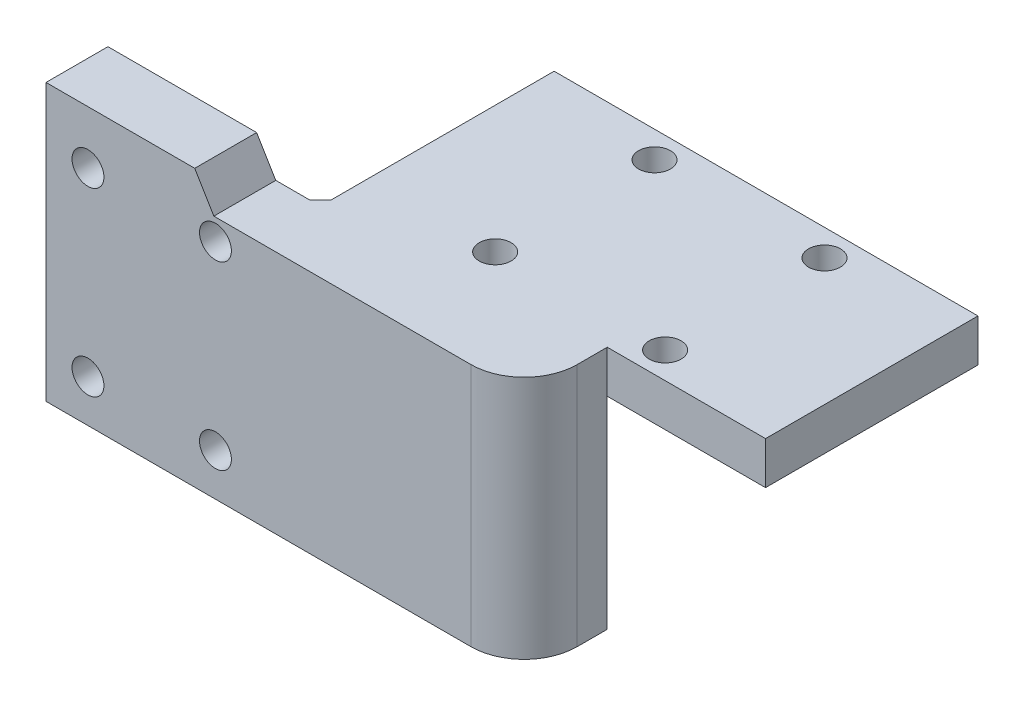
ISO-10303-21;
HEADER;
FILE_DESCRIPTION(('STEP AP214'),'2;1');
FILE_NAME('part.step','',(''),(''),'','','');
FILE_SCHEMA(('AUTOMOTIVE_DESIGN { 1 0 10303 214 1 1 1 1 }'));
ENDSEC;
DATA;
#1=APPLICATION_CONTEXT('core data for automotive mechanical design processes');
#2=APPLICATION_PROTOCOL_DEFINITION('international standard','automotive_design',2000,#1);
#3=PRODUCT_CONTEXT('',#1,'mechanical');
#4=PRODUCT('Part','Part','',(#3));
#5=PRODUCT_RELATED_PRODUCT_CATEGORY('part','',(#4));
#6=PRODUCT_DEFINITION_FORMATION('','',#4);
#7=PRODUCT_DEFINITION_CONTEXT('part definition',#1,'design');
#8=PRODUCT_DEFINITION('design','',#6,#7);
#9=PRODUCT_DEFINITION_SHAPE('','',#8);
#10=(LENGTH_UNIT() NAMED_UNIT(*) SI_UNIT(.MILLI.,.METRE.));
#11=(NAMED_UNIT(*) PLANE_ANGLE_UNIT() SI_UNIT($,.RADIAN.));
#12=(NAMED_UNIT(*) SI_UNIT($,.STERADIAN.) SOLID_ANGLE_UNIT());
#13=UNCERTAINTY_MEASURE_WITH_UNIT(LENGTH_MEASURE(1.E-05),#10,'distance_accuracy_value','');
#14=(GEOMETRIC_REPRESENTATION_CONTEXT(3) GLOBAL_UNCERTAINTY_ASSIGNED_CONTEXT((#13)) GLOBAL_UNIT_ASSIGNED_CONTEXT((#10,
#11,#12)) REPRESENTATION_CONTEXT('',''));
#15=CARTESIAN_POINT('',(0.,0.,0.));
#16=DIRECTION('',(0.,0.,1.));
#17=DIRECTION('',(1.,0.,0.));
#18=AXIS2_PLACEMENT_3D('',#15,#16,#17);
#19=CARTESIAN_POINT('',(0.,4.,0.));
#20=DIRECTION('',(0.,-1.,0.));
#21=DIRECTION('',(0.,0.,-1.));
#22=AXIS2_PLACEMENT_3D('',#19,#20,#21);
#23=PLANE('',#22);
#24=CARTESIAN_POINT('',(-8.,4.,-7.5));
#25=DIRECTION('',(0.,1.,0.));
#26=DIRECTION('',(0.,0.,-1.));
#27=AXIS2_PLACEMENT_3D('',#24,#25,#26);
#28=CIRCLE('',#27,1.5);
#29=CARTESIAN_POINT('',(-8.,4.,-9.));
#30=VERTEX_POINT('',#29);
#31=EDGE_CURVE('E252',#30,#30,#28,.T.);
#32=ORIENTED_EDGE('',*,*,#31,.F.);
#33=EDGE_LOOP('',(#32));
#34=FACE_BOUND('',#33,.T.);
#35=CARTESIAN_POINT('',(-8.,4.,7.5));
#36=DIRECTION('',(0.,1.,0.));
#37=DIRECTION('',(0.,0.,1.));
#38=AXIS2_PLACEMENT_3D('',#35,#36,#37);
#39=CIRCLE('',#38,1.5);
#40=CARTESIAN_POINT('',(-8.,4.,9.));
#41=VERTEX_POINT('',#40);
#42=EDGE_CURVE('E260',#41,#41,#39,.T.);
#43=ORIENTED_EDGE('',*,*,#42,.F.);
#44=EDGE_LOOP('',(#43));
#45=FACE_BOUND('',#44,.T.);
#46=CARTESIAN_POINT('',(8.,4.,7.5));
#47=DIRECTION('',(0.,1.,0.));
#48=DIRECTION('',(0.,0.,-1.));
#49=AXIS2_PLACEMENT_3D('',#46,#47,#48);
#50=CIRCLE('',#49,1.5);
#51=CARTESIAN_POINT('',(8.,4.,6.));
#52=VERTEX_POINT('',#51);
#53=EDGE_CURVE('E268',#52,#52,#50,.T.);
#54=ORIENTED_EDGE('',*,*,#53,.F.);
#55=EDGE_LOOP('',(#54));
#56=FACE_BOUND('',#55,.T.);
#57=CARTESIAN_POINT('',(8.,4.,-7.5));
#58=DIRECTION('',(0.,1.,0.));
#59=DIRECTION('',(0.,0.,1.));
#60=AXIS2_PLACEMENT_3D('',#57,#58,#59);
#61=CIRCLE('',#60,1.5);
#62=CARTESIAN_POINT('',(8.,4.,-6.));
#63=VERTEX_POINT('',#62);
#64=EDGE_CURVE('E276',#63,#63,#61,.T.);
#65=ORIENTED_EDGE('',*,*,#64,.F.);
#66=EDGE_LOOP('',(#65));
#67=FACE_BOUND('',#66,.T.);
#68=DIRECTION('',(0.,0.,-1.));
#69=VECTOR('',#68,1.);
#70=CARTESIAN_POINT('',(-19.95,4.,10.));
#71=LINE('',#70,#69);
#72=CARTESIAN_POINT('',(-19.95,4.,11.));
#73=VERTEX_POINT('',#72);
#74=CARTESIAN_POINT('',(-19.95,4.,-10.));
#75=VERTEX_POINT('',#74);
#76=EDGE_CURVE('E201',#73,#75,#71,.T.);
#77=ORIENTED_EDGE('',*,*,#76,.F.);
#78=DIRECTION('',(0.70710678118655,0.,-0.707106781186545));
#79=VECTOR('',#78,1.);
#80=CARTESIAN_POINT('',(-4.47499999999993,4.,-4.47499999999996));
#81=LINE('',#80,#79);
#82=CARTESIAN_POINT('',(-20.95,4.,12.));
#83=VERTEX_POINT('',#82);
#84=EDGE_CURVE('E54',#73,#83,#81,.F.);
#85=ORIENTED_EDGE('',*,*,#84,.T.);
#86=DIRECTION('',(1.,0.,0.));
#87=VECTOR('',#86,1.);
#88=CARTESIAN_POINT('',(0.,4.,12.));
#89=LINE('',#88,#87);
#90=CARTESIAN_POINT('',(-24.15,4.,12.));
#91=VERTEX_POINT('',#90);
#92=EDGE_CURVE('E343',#91,#83,#89,.T.);
#93=ORIENTED_EDGE('',*,*,#92,.F.);
#94=DIRECTION('',(0.,0.,1.));
#95=VECTOR('',#94,1.);
#96=CARTESIAN_POINT('',(-24.15,4.,7.83));
#97=LINE('',#96,#95);
#98=CARTESIAN_POINT('',(-24.15,4.,17.83));
#99=VERTEX_POINT('',#98);
#100=EDGE_CURVE('E158',#91,#99,#97,.T.);
#101=ORIENTED_EDGE('',*,*,#100,.T.);
#102=DIRECTION('',(1.,0.,0.));
#103=VECTOR('',#102,1.);
#104=CARTESIAN_POINT('',(-39.95,4.,17.83));
#105=LINE('',#104,#103);
#106=CARTESIAN_POINT('',(0.0500000000000084,4.,17.83));
#107=VERTEX_POINT('',#106);
#108=EDGE_CURVE('E155',#99,#107,#105,.T.);
#109=ORIENTED_EDGE('',*,*,#108,.T.);
#110=CARTESIAN_POINT('',(0.0500000000000058,4.,12.83));
#111=DIRECTION('',(0.,-1.,0.));
#112=DIRECTION('',(0.,0.,-1.));
#113=AXIS2_PLACEMENT_3D('',#110,#111,#112);
#114=CIRCLE('',#113,5.);
#115=CARTESIAN_POINT('',(5.05000000000001,4.,12.83));
#116=VERTEX_POINT('',#115);
#117=EDGE_CURVE('E324',#107,#116,#114,.F.);
#118=ORIENTED_EDGE('',*,*,#117,.T.);
#119=DIRECTION('',(0.,0.,-1.));
#120=VECTOR('',#119,1.);
#121=CARTESIAN_POINT('',(5.05000000000001,4.,51.8005755029261));
#122=LINE('',#121,#120);
#123=CARTESIAN_POINT('',(5.05000000000001,4.,10.));
#124=VERTEX_POINT('',#123);
#125=EDGE_CURVE('E213',#116,#124,#122,.T.);
#126=ORIENTED_EDGE('',*,*,#125,.T.);
#127=DIRECTION('',(1.,0.,0.));
#128=VECTOR('',#127,1.);
#129=CARTESIAN_POINT('',(-19.95,4.,10.));
#130=LINE('',#129,#128);
#131=CARTESIAN_POINT('',(19.95,4.,10.));
#132=VERTEX_POINT('',#131);
#133=EDGE_CURVE('E293',#124,#132,#130,.T.);
#134=ORIENTED_EDGE('',*,*,#133,.T.);
#135=DIRECTION('',(0.,0.,-1.));
#136=VECTOR('',#135,1.);
#137=CARTESIAN_POINT('',(19.95,4.,10.));
#138=LINE('',#137,#136);
#139=CARTESIAN_POINT('',(19.95,4.,-10.));
#140=VERTEX_POINT('',#139);
#141=EDGE_CURVE('E284',#132,#140,#138,.T.);
#142=ORIENTED_EDGE('',*,*,#141,.T.);
#143=DIRECTION('',(-1.,0.,0.));
#144=VECTOR('',#143,1.);
#145=CARTESIAN_POINT('',(-19.95,4.,-10.));
#146=LINE('',#145,#144);
#147=EDGE_CURVE('E288',#140,#75,#146,.T.);
#148=ORIENTED_EDGE('',*,*,#147,.T.);
#149=EDGE_LOOP('',(#77,#85,#93,#101,#109,#118,#126,#134,#142,#148));
#150=FACE_BOUND('',#149,.T.);
#151=ADVANCED_FACE('F44',(#34,#45,#56,#67,#150),#23,.F.);
#152=CARTESIAN_POINT('',(-39.95,0.,0.));
#153=DIRECTION('',(1.,0.,0.));
#154=DIRECTION('',(0.,0.,-1.));
#155=AXIS2_PLACEMENT_3D('',#152,#153,#154);
#156=PLANE('',#155);
#157=DIRECTION('',(0.,1.,0.));
#158=VECTOR('',#157,1.);
#159=CARTESIAN_POINT('',(-39.95,4.,17.83));
#160=LINE('',#159,#158);
#161=CARTESIAN_POINT('',(-39.95,-19.,17.83));
#162=VERTEX_POINT('',#161);
#163=CARTESIAN_POINT('',(-39.95,7.,17.83));
#164=VERTEX_POINT('',#163);
#165=EDGE_CURVE('E239',#162,#164,#160,.T.);
#166=ORIENTED_EDGE('',*,*,#165,.T.);
#167=DIRECTION('',(0.,0.,1.));
#168=VECTOR('',#167,1.);
#169=CARTESIAN_POINT('',(-39.95,7.,17.83));
#170=LINE('',#169,#168);
#171=CARTESIAN_POINT('',(-39.95,7.,12.));
#172=VERTEX_POINT('',#171);
#173=EDGE_CURVE('E163',#172,#164,#170,.T.);
#174=ORIENTED_EDGE('',*,*,#173,.F.);
#175=DIRECTION('',(0.,1.,0.));
#176=VECTOR('',#175,1.);
#177=CARTESIAN_POINT('',(-39.95,4.,12.));
#178=LINE('',#177,#176);
#179=CARTESIAN_POINT('',(-39.95,-19.,12.));
#180=VERTEX_POINT('',#179);
#181=EDGE_CURVE('E178',#180,#172,#178,.T.);
#182=ORIENTED_EDGE('',*,*,#181,.F.);
#183=DIRECTION('',(0.,0.,1.));
#184=VECTOR('',#183,1.);
#185=CARTESIAN_POINT('',(-39.95,-19.,17.83));
#186=LINE('',#185,#184);
#187=EDGE_CURVE('E236',#180,#162,#186,.T.);
#188=ORIENTED_EDGE('',*,*,#187,.T.);
#189=EDGE_LOOP('',(#166,#174,#182,#188));
#190=FACE_BOUND('',#189,.T.);
#191=ADVANCED_FACE('F355',(#190),#156,.F.);
#192=CARTESIAN_POINT('',(-36.,2.,2.83));
#193=DIRECTION('',(0.,0.,1.));
#194=DIRECTION('',(1.,0.,0.));
#195=AXIS2_PLACEMENT_3D('',#192,#193,#194);
#196=CYLINDRICAL_SURFACE('',#195,1.5);
#197=CARTESIAN_POINT('',(-36.,2.,12.));
#198=DIRECTION('',(0.,0.,1.));
#199=DIRECTION('',(1.,0.,0.));
#200=AXIS2_PLACEMENT_3D('',#197,#198,#199);
#201=CIRCLE('',#200,1.5);
#202=CARTESIAN_POINT('',(-34.5,2.,12.));
#203=VERTEX_POINT('',#202);
#204=EDGE_CURVE('E194',#203,#203,#201,.F.);
#205=ORIENTED_EDGE('',*,*,#204,.T.);
#206=EDGE_LOOP('',(#205));
#207=FACE_BOUND('',#206,.T.);
#208=CARTESIAN_POINT('',(-36.,2.,17.83));
#209=DIRECTION('',(0.,0.,1.));
#210=DIRECTION('',(1.,0.,0.));
#211=AXIS2_PLACEMENT_3D('',#208,#209,#210);
#212=CIRCLE('',#211,1.5);
#213=CARTESIAN_POINT('',(-34.5,2.,17.83));
#214=VERTEX_POINT('',#213);
#215=EDGE_CURVE('E229',#214,#214,#212,.T.);
#216=ORIENTED_EDGE('',*,*,#215,.T.);
#217=EDGE_LOOP('',(#216));
#218=FACE_BOUND('',#217,.T.);
#219=ADVANCED_FACE('F418',(#207,#218),#196,.F.);
#220=CARTESIAN_POINT('',(-24.,2.,2.83));
#221=DIRECTION('',(0.,0.,1.));
#222=DIRECTION('',(1.,0.,0.));
#223=AXIS2_PLACEMENT_3D('',#220,#221,#222);
#224=CYLINDRICAL_SURFACE('',#223,1.5);
#225=CARTESIAN_POINT('',(-24.,2.,12.));
#226=DIRECTION('',(0.,0.,1.));
#227=DIRECTION('',(1.,0.,0.));
#228=AXIS2_PLACEMENT_3D('',#225,#226,#227);
#229=CIRCLE('',#228,1.5);
#230=CARTESIAN_POINT('',(-22.5,2.,12.));
#231=VERTEX_POINT('',#230);
#232=EDGE_CURVE('E190',#231,#231,#229,.F.);
#233=ORIENTED_EDGE('',*,*,#232,.T.);
#234=EDGE_LOOP('',(#233));
#235=FACE_BOUND('',#234,.T.);
#236=CARTESIAN_POINT('',(-24.,2.,17.83));
#237=DIRECTION('',(0.,0.,1.));
#238=DIRECTION('',(1.,0.,0.));
#239=AXIS2_PLACEMENT_3D('',#236,#237,#238);
#240=CIRCLE('',#239,1.5);
#241=CARTESIAN_POINT('',(-22.5,2.,17.83));
#242=VERTEX_POINT('',#241);
#243=EDGE_CURVE('E225',#242,#242,#240,.T.);
#244=ORIENTED_EDGE('',*,*,#243,.T.);
#245=EDGE_LOOP('',(#244));
#246=FACE_BOUND('',#245,.T.);
#247=ADVANCED_FACE('F430',(#235,#246),#224,.F.);
#248=CARTESIAN_POINT('',(-19.95,4.,10.));
#249=DIRECTION('',(0.,0.,-1.));
#250=DIRECTION('',(-1.,0.,0.));
#251=AXIS2_PLACEMENT_3D('',#248,#249,#250);
#252=PLANE('',#251);
#253=DIRECTION('',(0.,1.,0.));
#254=VECTOR('',#253,1.);
#255=CARTESIAN_POINT('',(5.05000000000001,-19.,10.));
#256=LINE('',#255,#254);
#257=CARTESIAN_POINT('',(5.05000000000001,0.,10.));
#258=VERTEX_POINT('',#257);
#259=EDGE_CURVE('E206',#258,#124,#256,.T.);
#260=ORIENTED_EDGE('',*,*,#259,.F.);
#261=DIRECTION('',(1.,0.,0.));
#262=VECTOR('',#261,1.);
#263=CARTESIAN_POINT('',(-19.95,0.,10.));
#264=LINE('',#263,#262);
#265=CARTESIAN_POINT('',(19.95,0.,10.));
#266=VERTEX_POINT('',#265);
#267=EDGE_CURVE('E304',#258,#266,#264,.T.);
#268=ORIENTED_EDGE('',*,*,#267,.T.);
#269=DIRECTION('',(0.,-1.,0.));
#270=VECTOR('',#269,1.);
#271=CARTESIAN_POINT('',(19.95,4.,10.));
#272=LINE('',#271,#270);
#273=EDGE_CURVE('E296',#132,#266,#272,.T.);
#274=ORIENTED_EDGE('',*,*,#273,.F.);
#275=ORIENTED_EDGE('',*,*,#133,.F.);
#276=EDGE_LOOP('',(#260,#268,#274,#275));
#277=FACE_BOUND('',#276,.T.);
#278=ADVANCED_FACE('F383',(#277),#252,.F.);
#279=CARTESIAN_POINT('',(0.,0.,0.));
#280=DIRECTION('',(0.,-1.,0.));
#281=DIRECTION('',(0.,0.,-1.));
#282=AXIS2_PLACEMENT_3D('',#279,#280,#281);
#283=PLANE('',#282);
#284=DIRECTION('',(0.,0.,-1.));
#285=VECTOR('',#284,1.);
#286=CARTESIAN_POINT('',(-19.95,0.,10.));
#287=LINE('',#286,#285);
#288=CARTESIAN_POINT('',(-19.95,0.,10.));
#289=VERTEX_POINT('',#288);
#290=CARTESIAN_POINT('',(-19.95,0.,-10.));
#291=VERTEX_POINT('',#290);
#292=EDGE_CURVE('E202',#289,#291,#287,.T.);
#293=ORIENTED_EDGE('',*,*,#292,.T.);
#294=DIRECTION('',(-1.,0.,0.));
#295=VECTOR('',#294,1.);
#296=CARTESIAN_POINT('',(-19.95,0.,-10.));
#297=LINE('',#296,#295);
#298=CARTESIAN_POINT('',(19.95,0.,-10.));
#299=VERTEX_POINT('',#298);
#300=EDGE_CURVE('E300',#299,#291,#297,.T.);
#301=ORIENTED_EDGE('',*,*,#300,.F.);
#302=DIRECTION('',(0.,0.,-1.));
#303=VECTOR('',#302,1.);
#304=CARTESIAN_POINT('',(19.95,0.,10.));
#305=LINE('',#304,#303);
#306=EDGE_CURVE('E280',#266,#299,#305,.T.);
#307=ORIENTED_EDGE('',*,*,#306,.F.);
#308=ORIENTED_EDGE('',*,*,#267,.F.);
#309=EDGE_CURVE('E289',#289,#258,#264,.T.);
#310=ORIENTED_EDGE('',*,*,#309,.F.);
#311=EDGE_LOOP('',(#293,#301,#307,#308,#310));
#312=FACE_BOUND('',#311,.T.);
#313=CARTESIAN_POINT('',(-8.,0.,7.5));
#314=DIRECTION('',(0.,1.,0.));
#315=DIRECTION('',(0.,0.,1.));
#316=AXIS2_PLACEMENT_3D('',#313,#314,#315);
#317=CIRCLE('',#316,1.5);
#318=CARTESIAN_POINT('',(-8.,0.,9.));
#319=VERTEX_POINT('',#318);
#320=EDGE_CURVE('E256',#319,#319,#317,.T.);
#321=ORIENTED_EDGE('',*,*,#320,.T.);
#322=EDGE_LOOP('',(#321));
#323=FACE_BOUND('',#322,.T.);
#324=CARTESIAN_POINT('',(8.,0.,-7.5));
#325=DIRECTION('',(0.,1.,0.));
#326=DIRECTION('',(0.,0.,1.));
#327=AXIS2_PLACEMENT_3D('',#324,#325,#326);
#328=CIRCLE('',#327,1.5);
#329=CARTESIAN_POINT('',(8.,0.,-6.));
#330=VERTEX_POINT('',#329);
#331=EDGE_CURVE('E272',#330,#330,#328,.T.);
#332=ORIENTED_EDGE('',*,*,#331,.T.);
#333=EDGE_LOOP('',(#332));
#334=FACE_BOUND('',#333,.T.);
#335=CARTESIAN_POINT('',(8.,0.,7.5));
#336=DIRECTION('',(0.,1.,0.));
#337=DIRECTION('',(0.,0.,-1.));
#338=AXIS2_PLACEMENT_3D('',#335,#336,#337);
#339=CIRCLE('',#338,1.5);
#340=CARTESIAN_POINT('',(8.,0.,6.));
#341=VERTEX_POINT('',#340);
#342=EDGE_CURVE('E264',#341,#341,#339,.T.);
#343=ORIENTED_EDGE('',*,*,#342,.T.);
#344=EDGE_LOOP('',(#343));
#345=FACE_BOUND('',#344,.T.);
#346=CARTESIAN_POINT('',(-8.,0.,-7.5));
#347=DIRECTION('',(0.,1.,0.));
#348=DIRECTION('',(0.,0.,-1.));
#349=AXIS2_PLACEMENT_3D('',#346,#347,#348);
#350=CIRCLE('',#349,1.5);
#351=CARTESIAN_POINT('',(-8.,0.,-9.));
#352=VERTEX_POINT('',#351);
#353=EDGE_CURVE('E251',#352,#352,#350,.T.);
#354=ORIENTED_EDGE('',*,*,#353,.T.);
#355=EDGE_LOOP('',(#354));
#356=FACE_BOUND('',#355,.T.);
#357=ADVANCED_FACE('F388',(#312,#323,#334,#345,#356),#283,.T.);
#358=CARTESIAN_POINT('',(19.95,4.,10.));
#359=DIRECTION('',(-1.,0.,0.));
#360=DIRECTION('',(0.,0.,1.));
#361=AXIS2_PLACEMENT_3D('',#358,#359,#360);
#362=PLANE('',#361);
#363=ORIENTED_EDGE('',*,*,#306,.T.);
#364=DIRECTION('',(0.,-1.,0.));
#365=VECTOR('',#364,1.);
#366=CARTESIAN_POINT('',(19.95,4.,-10.));
#367=LINE('',#366,#365);
#368=EDGE_CURVE('E310',#140,#299,#367,.T.);
#369=ORIENTED_EDGE('',*,*,#368,.F.);
#370=ORIENTED_EDGE('',*,*,#141,.F.);
#371=ORIENTED_EDGE('',*,*,#273,.T.);
#372=EDGE_LOOP('',(#363,#369,#370,#371));
#373=FACE_BOUND('',#372,.T.);
#374=ADVANCED_FACE('F393',(#373),#362,.F.);
#375=CARTESIAN_POINT('',(-19.95,4.,-10.));
#376=DIRECTION('',(0.,0.,1.));
#377=DIRECTION('',(1.,0.,0.));
#378=AXIS2_PLACEMENT_3D('',#375,#376,#377);
#379=PLANE('',#378);
#380=ORIENTED_EDGE('',*,*,#300,.T.);
#381=DIRECTION('',(0.,-1.,0.));
#382=VECTOR('',#381,1.);
#383=CARTESIAN_POINT('',(-19.95,4.,-10.));
#384=LINE('',#383,#382);
#385=EDGE_CURVE('E198',#75,#291,#384,.T.);
#386=ORIENTED_EDGE('',*,*,#385,.F.);
#387=ORIENTED_EDGE('',*,*,#147,.F.);
#388=ORIENTED_EDGE('',*,*,#368,.T.);
#389=EDGE_LOOP('',(#380,#386,#387,#388));
#390=FACE_BOUND('',#389,.T.);
#391=ADVANCED_FACE('F397',(#390),#379,.F.);
#392=CARTESIAN_POINT('',(8.,4.,-7.5));
#393=DIRECTION('',(0.,-1.,0.));
#394=DIRECTION('',(0.,0.,-1.));
#395=AXIS2_PLACEMENT_3D('',#392,#393,#394);
#396=CYLINDRICAL_SURFACE('',#395,1.5);
#397=ORIENTED_EDGE('',*,*,#64,.T.);
#398=EDGE_LOOP('',(#397));
#399=FACE_BOUND('',#398,.T.);
#400=ORIENTED_EDGE('',*,*,#331,.F.);
#401=EDGE_LOOP('',(#400));
#402=FACE_BOUND('',#401,.T.);
#403=ADVANCED_FACE('F424',(#399,#402),#396,.F.);
#404=CARTESIAN_POINT('',(8.,4.,7.5));
#405=DIRECTION('',(0.,-1.,0.));
#406=DIRECTION('',(0.,0.,-1.));
#407=AXIS2_PLACEMENT_3D('',#404,#405,#406);
#408=CYLINDRICAL_SURFACE('',#407,1.5);
#409=ORIENTED_EDGE('',*,*,#53,.T.);
#410=EDGE_LOOP('',(#409));
#411=FACE_BOUND('',#410,.T.);
#412=ORIENTED_EDGE('',*,*,#342,.F.);
#413=EDGE_LOOP('',(#412));
#414=FACE_BOUND('',#413,.T.);
#415=ADVANCED_FACE('F450',(#411,#414),#408,.F.);
#416=CARTESIAN_POINT('',(-8.,4.,7.5));
#417=DIRECTION('',(0.,-1.,0.));
#418=DIRECTION('',(0.,0.,-1.));
#419=AXIS2_PLACEMENT_3D('',#416,#417,#418);
#420=CYLINDRICAL_SURFACE('',#419,1.5);
#421=ORIENTED_EDGE('',*,*,#42,.T.);
#422=EDGE_LOOP('',(#421));
#423=FACE_BOUND('',#422,.T.);
#424=ORIENTED_EDGE('',*,*,#320,.F.);
#425=EDGE_LOOP('',(#424));
#426=FACE_BOUND('',#425,.T.);
#427=ADVANCED_FACE('F457',(#423,#426),#420,.F.);
#428=CARTESIAN_POINT('',(-8.,4.,-7.5));
#429=DIRECTION('',(0.,-1.,0.));
#430=DIRECTION('',(0.,0.,-1.));
#431=AXIS2_PLACEMENT_3D('',#428,#429,#430);
#432=CYLINDRICAL_SURFACE('',#431,1.5);
#433=ORIENTED_EDGE('',*,*,#31,.T.);
#434=EDGE_LOOP('',(#433));
#435=FACE_BOUND('',#434,.T.);
#436=ORIENTED_EDGE('',*,*,#353,.F.);
#437=EDGE_LOOP('',(#436));
#438=FACE_BOUND('',#437,.T.);
#439=ADVANCED_FACE('F464',(#435,#438),#432,.F.);
#440=CARTESIAN_POINT('',(-39.95,-19.,10.));
#441=DIRECTION('',(0.,0.,1.));
#442=DIRECTION('',(1.,0.,0.));
#443=AXIS2_PLACEMENT_3D('',#440,#441,#442);
#444=PLANE('',#443);
#445=DIRECTION('',(1.,0.,0.));
#446=VECTOR('',#445,1.);
#447=CARTESIAN_POINT('',(-39.95,-19.,10.));
#448=LINE('',#447,#446);
#449=CARTESIAN_POINT('',(-19.95,-19.,10.));
#450=VERTEX_POINT('',#449);
#451=CARTESIAN_POINT('',(5.05000000000001,-19.,10.));
#452=VERTEX_POINT('',#451);
#453=EDGE_CURVE('E248',#450,#452,#448,.T.);
#454=ORIENTED_EDGE('',*,*,#453,.F.);
#455=DIRECTION('',(0.,-1.,0.));
#456=VECTOR('',#455,1.);
#457=CARTESIAN_POINT('',(-19.95,-19.,10.));
#458=LINE('',#457,#456);
#459=EDGE_CURVE('E165',#289,#450,#458,.T.);
#460=ORIENTED_EDGE('',*,*,#459,.F.);
#461=ORIENTED_EDGE('',*,*,#309,.T.);
#462=EDGE_CURVE('E209',#452,#258,#256,.T.);
#463=ORIENTED_EDGE('',*,*,#462,.F.);
#464=EDGE_LOOP('',(#454,#460,#461,#463));
#465=FACE_BOUND('',#464,.T.);
#466=ADVANCED_FACE('F376',(#465),#444,.F.);
#467=CARTESIAN_POINT('',(-39.95,-19.,17.83));
#468=DIRECTION('',(0.,1.,0.));
#469=DIRECTION('',(0.,0.,1.));
#470=AXIS2_PLACEMENT_3D('',#467,#468,#469);
#471=PLANE('',#470);
#472=DIRECTION('',(-1.,0.,0.));
#473=VECTOR('',#472,1.);
#474=CARTESIAN_POINT('',(-39.95,-19.,12.));
#475=LINE('',#474,#473);
#476=CARTESIAN_POINT('',(-20.95,-19.,12.));
#477=VERTEX_POINT('',#476);
#478=EDGE_CURVE('E170',#477,#180,#475,.T.);
#479=ORIENTED_EDGE('',*,*,#478,.F.);
#480=DIRECTION('',(-0.70710678118655,0.,0.707106781186545));
#481=VECTOR('',#480,1.);
#482=CARTESIAN_POINT('',(-33.3650000000001,-19.,24.415));
#483=LINE('',#482,#481);
#484=CARTESIAN_POINT('',(-19.95,-19.,11.));
#485=VERTEX_POINT('',#484);
#486=EDGE_CURVE('E336',#477,#485,#483,.F.);
#487=ORIENTED_EDGE('',*,*,#486,.T.);
#488=DIRECTION('',(0.,0.,-1.));
#489=VECTOR('',#488,1.);
#490=CARTESIAN_POINT('',(-19.95,-19.,12.));
#491=LINE('',#490,#489);
#492=EDGE_CURVE('E181',#485,#450,#491,.T.);
#493=ORIENTED_EDGE('',*,*,#492,.T.);
#494=ORIENTED_EDGE('',*,*,#453,.T.);
#495=DIRECTION('',(0.,0.,-1.));
#496=VECTOR('',#495,1.);
#497=CARTESIAN_POINT('',(5.05000000000001,-19.,51.8005755029261));
#498=LINE('',#497,#496);
#499=CARTESIAN_POINT('',(5.05000000000001,-19.,12.83));
#500=VERTEX_POINT('',#499);
#501=EDGE_CURVE('E216',#500,#452,#498,.T.);
#502=ORIENTED_EDGE('',*,*,#501,.F.);
#503=CARTESIAN_POINT('',(0.0500000000000058,-19.,12.83));
#504=DIRECTION('',(0.,1.,0.));
#505=DIRECTION('',(0.,0.,1.));
#506=AXIS2_PLACEMENT_3D('',#503,#504,#505);
#507=CIRCLE('',#506,5.);
#508=CARTESIAN_POINT('',(0.0500000000000084,-19.,17.83));
#509=VERTEX_POINT('',#508);
#510=EDGE_CURVE('E318',#500,#509,#507,.F.);
#511=ORIENTED_EDGE('',*,*,#510,.T.);
#512=DIRECTION('',(1.,0.,0.));
#513=VECTOR('',#512,1.);
#514=CARTESIAN_POINT('',(-39.95,-19.,17.83));
#515=LINE('',#514,#513);
#516=EDGE_CURVE('E244',#162,#509,#515,.T.);
#517=ORIENTED_EDGE('',*,*,#516,.F.);
#518=ORIENTED_EDGE('',*,*,#187,.F.);
#519=EDGE_LOOP('',(#479,#487,#493,#494,#502,#511,#517,#518));
#520=FACE_BOUND('',#519,.T.);
#521=ADVANCED_FACE('F352',(#520),#471,.F.);
#522=CARTESIAN_POINT('',(-39.95,4.,17.83));
#523=DIRECTION('',(0.,0.,-1.));
#524=DIRECTION('',(0.,1.,0.));
#525=AXIS2_PLACEMENT_3D('',#522,#523,#524);
#526=PLANE('',#525);
#527=ORIENTED_EDGE('',*,*,#243,.F.);
#528=EDGE_LOOP('',(#527));
#529=FACE_BOUND('',#528,.T.);
#530=CARTESIAN_POINT('',(-36.,-15.,17.83));
#531=DIRECTION('',(0.,0.,1.));
#532=DIRECTION('',(1.,0.,0.));
#533=AXIS2_PLACEMENT_3D('',#530,#531,#532);
#534=CIRCLE('',#533,1.5);
#535=CARTESIAN_POINT('',(-34.5,-15.,17.83));
#536=VERTEX_POINT('',#535);
#537=EDGE_CURVE('E224',#536,#536,#534,.T.);
#538=ORIENTED_EDGE('',*,*,#537,.F.);
#539=EDGE_LOOP('',(#538));
#540=FACE_BOUND('',#539,.T.);
#541=CARTESIAN_POINT('',(-24.,-15.,17.83));
#542=DIRECTION('',(0.,0.,1.));
#543=DIRECTION('',(1.,0.,0.));
#544=AXIS2_PLACEMENT_3D('',#541,#542,#543);
#545=CIRCLE('',#544,1.5);
#546=CARTESIAN_POINT('',(-22.5,-15.,17.83));
#547=VERTEX_POINT('',#546);
#548=EDGE_CURVE('E220',#547,#547,#545,.T.);
#549=ORIENTED_EDGE('',*,*,#548,.F.);
#550=EDGE_LOOP('',(#549));
#551=FACE_BOUND('',#550,.T.);
#552=ORIENTED_EDGE('',*,*,#215,.F.);
#553=EDGE_LOOP('',(#552));
#554=FACE_BOUND('',#553,.T.);
#555=ORIENTED_EDGE('',*,*,#108,.F.);
#556=DIRECTION('',(0.514495755427526,-0.857492925712545,0.));
#557=VECTOR('',#556,1.);
#558=CARTESIAN_POINT('',(-24.15,4.,17.83));
#559=LINE('',#558,#557);
#560=CARTESIAN_POINT('',(-25.95,7.,17.83));
#561=VERTEX_POINT('',#560);
#562=EDGE_CURVE('E145',#561,#99,#559,.T.);
#563=ORIENTED_EDGE('',*,*,#562,.F.);
#564=DIRECTION('',(1.,0.,0.));
#565=VECTOR('',#564,1.);
#566=CARTESIAN_POINT('',(-19.95,7.,17.83));
#567=LINE('',#566,#565);
#568=EDGE_CURVE('E153',#164,#561,#567,.T.);
#569=ORIENTED_EDGE('',*,*,#568,.F.);
#570=ORIENTED_EDGE('',*,*,#165,.F.);
#571=ORIENTED_EDGE('',*,*,#516,.T.);
#572=DIRECTION('',(0.,-1.,0.));
#573=VECTOR('',#572,1.);
#574=CARTESIAN_POINT('',(0.0500000000000084,4.,17.83));
#575=LINE('',#574,#573);
#576=EDGE_CURVE('E321',#509,#107,#575,.F.);
#577=ORIENTED_EDGE('',*,*,#576,.T.);
#578=EDGE_LOOP('',(#555,#563,#569,#570,#571,#577));
#579=FACE_BOUND('',#578,.T.);
#580=ADVANCED_FACE('F151',(#529,#540,#551,#554,#579),#526,.F.);
#581=CARTESIAN_POINT('',(-24.,-15.,2.83));
#582=DIRECTION('',(0.,0.,1.));
#583=DIRECTION('',(1.,0.,0.));
#584=AXIS2_PLACEMENT_3D('',#581,#582,#583);
#585=CYLINDRICAL_SURFACE('',#584,1.5);
#586=CARTESIAN_POINT('',(-24.,-15.,12.));
#587=DIRECTION('',(0.,0.,1.));
#588=DIRECTION('',(1.,0.,0.));
#589=AXIS2_PLACEMENT_3D('',#586,#587,#588);
#590=CIRCLE('',#589,1.5);
#591=CARTESIAN_POINT('',(-22.5,-15.,12.));
#592=VERTEX_POINT('',#591);
#593=EDGE_CURVE('E186',#592,#592,#590,.F.);
#594=ORIENTED_EDGE('',*,*,#593,.T.);
#595=EDGE_LOOP('',(#594));
#596=FACE_BOUND('',#595,.T.);
#597=ORIENTED_EDGE('',*,*,#548,.T.);
#598=EDGE_LOOP('',(#597));
#599=FACE_BOUND('',#598,.T.);
#600=ADVANCED_FACE('F493',(#596,#599),#585,.F.);
#601=CARTESIAN_POINT('',(-36.,-15.,2.83));
#602=DIRECTION('',(0.,0.,1.));
#603=DIRECTION('',(1.,0.,0.));
#604=AXIS2_PLACEMENT_3D('',#601,#602,#603);
#605=CYLINDRICAL_SURFACE('',#604,1.5);
#606=CARTESIAN_POINT('',(-36.,-15.,12.));
#607=DIRECTION('',(0.,0.,1.));
#608=DIRECTION('',(1.,0.,0.));
#609=AXIS2_PLACEMENT_3D('',#606,#607,#608);
#610=CIRCLE('',#609,1.5);
#611=CARTESIAN_POINT('',(-34.5,-15.,12.));
#612=VERTEX_POINT('',#611);
#613=EDGE_CURVE('E185',#612,#612,#610,.F.);
#614=ORIENTED_EDGE('',*,*,#613,.T.);
#615=EDGE_LOOP('',(#614));
#616=FACE_BOUND('',#615,.T.);
#617=ORIENTED_EDGE('',*,*,#537,.T.);
#618=EDGE_LOOP('',(#617));
#619=FACE_BOUND('',#618,.T.);
#620=ADVANCED_FACE('F407',(#616,#619),#605,.F.);
#621=CARTESIAN_POINT('',(5.05000000000001,-19.,51.8005755029261));
#622=DIRECTION('',(-1.,0.,0.));
#623=DIRECTION('',(0.,0.,1.));
#624=AXIS2_PLACEMENT_3D('',#621,#622,#623);
#625=PLANE('',#624);
#626=ORIENTED_EDGE('',*,*,#125,.F.);
#627=DIRECTION('',(0.,-1.,0.));
#628=VECTOR('',#627,1.);
#629=CARTESIAN_POINT('',(5.05000000000001,-19.,12.83));
#630=LINE('',#629,#628);
#631=EDGE_CURVE('E314',#116,#500,#630,.T.);
#632=ORIENTED_EDGE('',*,*,#631,.T.);
#633=ORIENTED_EDGE('',*,*,#501,.T.);
#634=ORIENTED_EDGE('',*,*,#462,.T.);
#635=ORIENTED_EDGE('',*,*,#259,.T.);
#636=EDGE_LOOP('',(#626,#632,#633,#634,#635));
#637=FACE_BOUND('',#636,.T.);
#638=ADVANCED_FACE('F371',(#637),#625,.F.);
#639=CARTESIAN_POINT('',(-19.95,4.,10.));
#640=DIRECTION('',(1.,0.,0.));
#641=DIRECTION('',(0.,0.,-1.));
#642=AXIS2_PLACEMENT_3D('',#639,#640,#641);
#643=PLANE('',#642);
#644=ORIENTED_EDGE('',*,*,#492,.F.);
#645=DIRECTION('',(0.,1.,0.));
#646=VECTOR('',#645,1.);
#647=CARTESIAN_POINT('',(-19.95,4.,11.));
#648=LINE('',#647,#646);
#649=EDGE_CURVE('E68',#485,#73,#648,.T.);
#650=ORIENTED_EDGE('',*,*,#649,.T.);
#651=ORIENTED_EDGE('',*,*,#76,.T.);
#652=ORIENTED_EDGE('',*,*,#385,.T.);
#653=ORIENTED_EDGE('',*,*,#292,.F.);
#654=ORIENTED_EDGE('',*,*,#459,.T.);
#655=EDGE_LOOP('',(#644,#650,#651,#652,#653,#654));
#656=FACE_BOUND('',#655,.T.);
#657=ADVANCED_FACE('F398',(#656),#643,.F.);
#658=CARTESIAN_POINT('',(0.0500000000000058,-19.,12.83));
#659=DIRECTION('',(0.,-1.,0.));
#660=DIRECTION('',(0.,0.,-1.));
#661=AXIS2_PLACEMENT_3D('',#658,#659,#660);
#662=CYLINDRICAL_SURFACE('',#661,5.);
#663=ORIENTED_EDGE('',*,*,#117,.F.);
#664=ORIENTED_EDGE('',*,*,#576,.F.);
#665=ORIENTED_EDGE('',*,*,#510,.F.);
#666=ORIENTED_EDGE('',*,*,#631,.F.);
#667=EDGE_LOOP('',(#663,#664,#665,#666));
#668=FACE_BOUND('',#667,.T.);
#669=ADVANCED_FACE('F368',(#668),#662,.T.);
#670=CARTESIAN_POINT('',(0.,0.,12.));
#671=DIRECTION('',(0.,0.,1.));
#672=DIRECTION('',(1.,0.,0.));
#673=AXIS2_PLACEMENT_3D('',#670,#671,#672);
#674=PLANE('',#673);
#675=ORIENTED_EDGE('',*,*,#232,.F.);
#676=EDGE_LOOP('',(#675));
#677=FACE_BOUND('',#676,.T.);
#678=ORIENTED_EDGE('',*,*,#613,.F.);
#679=EDGE_LOOP('',(#678));
#680=FACE_BOUND('',#679,.T.);
#681=DIRECTION('',(0.514495755427526,-0.857492925712545,0.));
#682=VECTOR('',#681,1.);
#683=CARTESIAN_POINT('',(-15.9926470588236,-9.59558823529411,12.));
#684=LINE('',#683,#682);
#685=CARTESIAN_POINT('',(-25.95,7.,12.));
#686=VERTEX_POINT('',#685);
#687=EDGE_CURVE('E61',#686,#91,#684,.T.);
#688=ORIENTED_EDGE('',*,*,#687,.T.);
#689=ORIENTED_EDGE('',*,*,#92,.T.);
#690=DIRECTION('',(0.,-1.,0.));
#691=VECTOR('',#690,1.);
#692=CARTESIAN_POINT('',(-20.95,-19.,12.));
#693=LINE('',#692,#691);
#694=EDGE_CURVE('E327',#83,#477,#693,.T.);
#695=ORIENTED_EDGE('',*,*,#694,.T.);
#696=ORIENTED_EDGE('',*,*,#478,.T.);
#697=ORIENTED_EDGE('',*,*,#181,.T.);
#698=DIRECTION('',(-1.,0.,0.));
#699=VECTOR('',#698,1.);
#700=CARTESIAN_POINT('',(-39.95,7.,12.));
#701=LINE('',#700,#699);
#702=EDGE_CURVE('E172',#686,#172,#701,.T.);
#703=ORIENTED_EDGE('',*,*,#702,.F.);
#704=EDGE_LOOP('',(#688,#689,#695,#696,#697,#703));
#705=FACE_BOUND('',#704,.T.);
#706=ORIENTED_EDGE('',*,*,#593,.F.);
#707=EDGE_LOOP('',(#706));
#708=FACE_BOUND('',#707,.T.);
#709=ORIENTED_EDGE('',*,*,#204,.F.);
#710=EDGE_LOOP('',(#709));
#711=FACE_BOUND('',#710,.T.);
#712=ADVANCED_FACE('F347',(#677,#680,#705,#708,#711),#674,.F.);
#713=CARTESIAN_POINT('',(0.,7.,0.));
#714=DIRECTION('',(0.,-1.,0.));
#715=DIRECTION('',(0.,0.,-1.));
#716=AXIS2_PLACEMENT_3D('',#713,#714,#715);
#717=PLANE('',#716);
#718=ORIENTED_EDGE('',*,*,#568,.T.);
#719=DIRECTION('',(0.,0.,-1.));
#720=VECTOR('',#719,1.);
#721=CARTESIAN_POINT('',(-25.95,7.,0.));
#722=LINE('',#721,#720);
#723=EDGE_CURVE('E11',#561,#686,#722,.T.);
#724=ORIENTED_EDGE('',*,*,#723,.T.);
#725=ORIENTED_EDGE('',*,*,#702,.T.);
#726=ORIENTED_EDGE('',*,*,#173,.T.);
#727=EDGE_LOOP('',(#718,#724,#725,#726));
#728=FACE_BOUND('',#727,.T.);
#729=ADVANCED_FACE('F161',(#728),#717,.F.);
#730=CARTESIAN_POINT('',(-20.95,0.,12.));
#731=DIRECTION('',(-0.707106781186545,0.,-0.70710678118655));
#732=DIRECTION('',(0.,1.,0.));
#733=AXIS2_PLACEMENT_3D('',#730,#731,#732);
#734=PLANE('',#733);
#735=ORIENTED_EDGE('',*,*,#84,.F.);
#736=ORIENTED_EDGE('',*,*,#649,.F.);
#737=ORIENTED_EDGE('',*,*,#486,.F.);
#738=ORIENTED_EDGE('',*,*,#694,.F.);
#739=EDGE_LOOP('',(#735,#736,#737,#738));
#740=FACE_BOUND('',#739,.T.);
#741=ADVANCED_FACE('F47',(#740),#734,.T.);
#742=CARTESIAN_POINT('',(-24.15,4.,7.83));
#743=DIRECTION('',(-0.857492925712545,-0.514495755427526,0.));
#744=DIRECTION('',(0.514495755427526,-0.857492925712545,0.));
#745=AXIS2_PLACEMENT_3D('',#742,#743,#744);
#746=PLANE('',#745);
#747=ORIENTED_EDGE('',*,*,#723,.F.);
#748=ORIENTED_EDGE('',*,*,#562,.T.);
#749=ORIENTED_EDGE('',*,*,#100,.F.);
#750=ORIENTED_EDGE('',*,*,#687,.F.);
#751=EDGE_LOOP('',(#747,#748,#749,#750));
#752=FACE_BOUND('',#751,.T.);
#753=ADVANCED_FACE('F144',(#752),#746,.F.);
#754=CLOSED_SHELL('',(#151,#191,#219,#247,#278,#357,#374,#391,#403,#415,#427,#439,#466,#521,
#580,#600,#620,#638,#657,#669,#712,#729,#741,#753));
#755=MANIFOLD_SOLID_BREP('B2',#754);
#756=ADVANCED_BREP_SHAPE_REPRESENTATION('',(#18,#755),#14);
#757=SHAPE_DEFINITION_REPRESENTATION(#9,#756);
ENDSEC;
END-ISO-10303-21;
